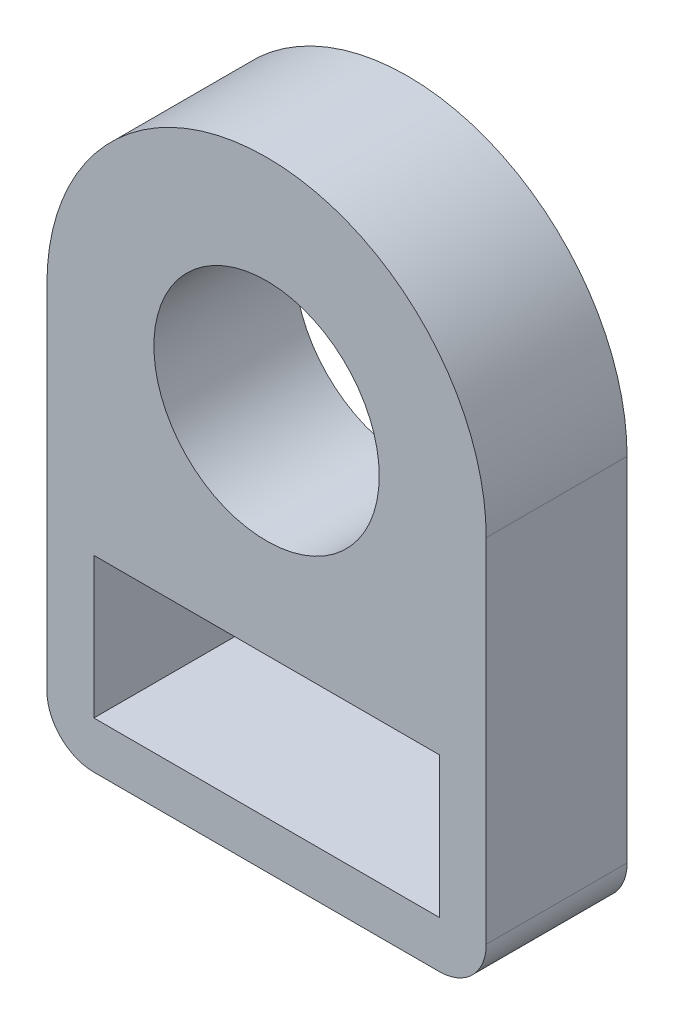
ISO-10303-21;
HEADER;
FILE_DESCRIPTION(('STEP AP214'),'2;1');
FILE_NAME('part.step','',(''),(''),'','','');
FILE_SCHEMA(('AUTOMOTIVE_DESIGN { 1 0 10303 214 1 1 1 1 }'));
ENDSEC;
DATA;
#1=APPLICATION_CONTEXT('core data for automotive mechanical design processes');
#2=APPLICATION_PROTOCOL_DEFINITION('international standard','automotive_design',2000,#1);
#3=PRODUCT_CONTEXT('',#1,'mechanical');
#4=PRODUCT('Part','Part','',(#3));
#5=PRODUCT_RELATED_PRODUCT_CATEGORY('part','',(#4));
#6=PRODUCT_DEFINITION_FORMATION('','',#4);
#7=PRODUCT_DEFINITION_CONTEXT('part definition',#1,'design');
#8=PRODUCT_DEFINITION('design','',#6,#7);
#9=PRODUCT_DEFINITION_SHAPE('','',#8);
#10=(LENGTH_UNIT() NAMED_UNIT(*) SI_UNIT(.MILLI.,.METRE.));
#11=(NAMED_UNIT(*) PLANE_ANGLE_UNIT() SI_UNIT($,.RADIAN.));
#12=(NAMED_UNIT(*) SI_UNIT($,.STERADIAN.) SOLID_ANGLE_UNIT());
#13=UNCERTAINTY_MEASURE_WITH_UNIT(LENGTH_MEASURE(1.E-05),#10,'distance_accuracy_value','');
#14=(GEOMETRIC_REPRESENTATION_CONTEXT(3) GLOBAL_UNCERTAINTY_ASSIGNED_CONTEXT((#13)) GLOBAL_UNIT_ASSIGNED_CONTEXT((#10,
#11,#12)) REPRESENTATION_CONTEXT('',''));
#15=CARTESIAN_POINT('',(0.,0.,0.));
#16=DIRECTION('',(0.,0.,1.));
#17=DIRECTION('',(1.,0.,0.));
#18=AXIS2_PLACEMENT_3D('',#15,#16,#17);
#19=CARTESIAN_POINT('',(-18.39,-7.5,15.));
#20=DIRECTION('',(0.,0.,-1.));
#21=DIRECTION('',(-1.,0.,0.));
#22=AXIS2_PLACEMENT_3D('',#19,#20,#21);
#23=PLANE('',#22);
#24=CARTESIAN_POINT('',(-18.39,-7.5,15.));
#25=DIRECTION('',(0.,0.,1.));
#26=DIRECTION('',(-1.,0.,0.));
#27=AXIS2_PLACEMENT_3D('',#24,#25,#26);
#28=CIRCLE('',#27,5.);
#29=CARTESIAN_POINT('',(-23.39,-7.5,15.));
#30=VERTEX_POINT('',#29);
#31=CARTESIAN_POINT('',(-18.39,-12.5,15.));
#32=VERTEX_POINT('',#31);
#33=EDGE_CURVE('E150',#30,#32,#28,.T.);
#34=ORIENTED_EDGE('',*,*,#33,.T.);
#35=DIRECTION('',(1.,0.,0.));
#36=VECTOR('',#35,1.);
#37=CARTESIAN_POINT('',(-18.39,-12.5,15.));
#38=LINE('',#37,#36);
#39=CARTESIAN_POINT('',(18.3903669358991,-12.5,15.));
#40=VERTEX_POINT('',#39);
#41=EDGE_CURVE('E153',#32,#40,#38,.T.);
#42=ORIENTED_EDGE('',*,*,#41,.T.);
#43=CARTESIAN_POINT('',(18.3903669358991,-7.49999999999999,15.));
#44=DIRECTION('',(0.,0.,1.));
#45=DIRECTION('',(1.,0.,0.));
#46=AXIS2_PLACEMENT_3D('',#43,#44,#45);
#47=CIRCLE('',#46,5.);
#48=CARTESIAN_POINT('',(23.3903269571223,-7.48000534647723,15.));
#49=VERTEX_POINT('',#48);
#50=EDGE_CURVE('E156',#40,#49,#47,.T.);
#51=ORIENTED_EDGE('',*,*,#50,.T.);
#52=DIRECTION('',(0.,1.,0.));
#53=VECTOR('',#52,1.);
#54=CARTESIAN_POINT('',(23.3903269571223,-7.48000534647723,15.));
#55=LINE('',#54,#53);
#56=CARTESIAN_POINT('',(23.3903269571223,30.02,15.));
#57=VERTEX_POINT('',#56);
#58=EDGE_CURVE('E158',#49,#57,#55,.T.);
#59=ORIENTED_EDGE('',*,*,#58,.T.);
#60=CARTESIAN_POINT('',(0.000163478561169064,30.02,15.));
#61=DIRECTION('',(0.,0.,1.));
#62=DIRECTION('',(-1.,0.,0.));
#63=AXIS2_PLACEMENT_3D('',#60,#61,#62);
#64=CIRCLE('',#63,23.3901634785612);
#65=CARTESIAN_POINT('',(-23.39,30.02,15.));
#66=VERTEX_POINT('',#65);
#67=EDGE_CURVE('E160',#57,#66,#64,.T.);
#68=ORIENTED_EDGE('',*,*,#67,.T.);
#69=DIRECTION('',(0.,-1.,0.));
#70=VECTOR('',#69,1.);
#71=CARTESIAN_POINT('',(-23.39,-7.5,15.));
#72=LINE('',#71,#70);
#73=EDGE_CURVE('E162',#66,#30,#72,.T.);
#74=ORIENTED_EDGE('',*,*,#73,.T.);
#75=EDGE_LOOP('',(#34,#42,#51,#59,#68,#74));
#76=FACE_BOUND('',#75,.T.);
#77=DIRECTION('',(0.,1.,0.));
#78=VECTOR('',#77,1.);
#79=CARTESIAN_POINT('',(18.39,7.5,15.));
#80=LINE('',#79,#78);
#81=CARTESIAN_POINT('',(18.39,-7.5,15.));
#82=VERTEX_POINT('',#81);
#83=CARTESIAN_POINT('',(18.39,7.5,15.));
#84=VERTEX_POINT('',#83);
#85=EDGE_CURVE('E111',#82,#84,#80,.T.);
#86=ORIENTED_EDGE('',*,*,#85,.F.);
#87=DIRECTION('',(1.,0.,0.));
#88=VECTOR('',#87,1.);
#89=CARTESIAN_POINT('',(-18.39,-7.5,15.));
#90=LINE('',#89,#88);
#91=CARTESIAN_POINT('',(-18.39,-7.5,15.));
#92=VERTEX_POINT('',#91);
#93=EDGE_CURVE('E134',#92,#82,#90,.T.);
#94=ORIENTED_EDGE('',*,*,#93,.F.);
#95=DIRECTION('',(0.,-1.,0.));
#96=VECTOR('',#95,1.);
#97=CARTESIAN_POINT('',(-18.39,7.5,15.));
#98=LINE('',#97,#96);
#99=CARTESIAN_POINT('',(-18.39,7.5,15.));
#100=VERTEX_POINT('',#99);
#101=EDGE_CURVE('E132',#100,#92,#98,.T.);
#102=ORIENTED_EDGE('',*,*,#101,.F.);
#103=DIRECTION('',(-1.,0.,0.));
#104=VECTOR('',#103,1.);
#105=CARTESIAN_POINT('',(-18.39,7.5,15.));
#106=LINE('',#105,#104);
#107=EDGE_CURVE('E119',#84,#100,#106,.T.);
#108=ORIENTED_EDGE('',*,*,#107,.F.);
#109=EDGE_LOOP('',(#86,#94,#102,#108));
#110=FACE_BOUND('',#109,.T.);
#111=CARTESIAN_POINT('',(0.,30.02,15.));
#112=DIRECTION('',(0.,0.,1.));
#113=DIRECTION('',(1.,0.,0.));
#114=AXIS2_PLACEMENT_3D('',#111,#112,#113);
#115=CIRCLE('',#114,12.);
#116=CARTESIAN_POINT('',(12.,30.02,15.));
#117=VERTEX_POINT('',#116);
#118=EDGE_CURVE('E140',#117,#117,#115,.T.);
#119=ORIENTED_EDGE('',*,*,#118,.F.);
#120=EDGE_LOOP('',(#119));
#121=FACE_BOUND('',#120,.T.);
#122=ADVANCED_FACE('F34',(#76,#110,#121),#23,.F.);
#123=CARTESIAN_POINT('',(-18.39,-7.5,0.));
#124=DIRECTION('',(0.,0.,-1.));
#125=DIRECTION('',(-1.,0.,0.));
#126=AXIS2_PLACEMENT_3D('',#123,#124,#125);
#127=PLANE('',#126);
#128=DIRECTION('',(1.,0.,0.));
#129=VECTOR('',#128,1.);
#130=CARTESIAN_POINT('',(-18.39,-7.5,0.));
#131=LINE('',#130,#129);
#132=CARTESIAN_POINT('',(-18.39,-7.5,0.));
#133=VERTEX_POINT('',#132);
#134=CARTESIAN_POINT('',(18.39,-7.5,0.));
#135=VERTEX_POINT('',#134);
#136=EDGE_CURVE('E120',#133,#135,#131,.T.);
#137=ORIENTED_EDGE('',*,*,#136,.T.);
#138=DIRECTION('',(0.,1.,0.));
#139=VECTOR('',#138,1.);
#140=CARTESIAN_POINT('',(18.39,7.5,0.));
#141=LINE('',#140,#139);
#142=CARTESIAN_POINT('',(18.39,7.5,0.));
#143=VERTEX_POINT('',#142);
#144=EDGE_CURVE('E57',#135,#143,#141,.T.);
#145=ORIENTED_EDGE('',*,*,#144,.T.);
#146=DIRECTION('',(-1.,0.,0.));
#147=VECTOR('',#146,1.);
#148=CARTESIAN_POINT('',(-18.39,7.5,0.));
#149=LINE('',#148,#147);
#150=CARTESIAN_POINT('',(-18.39,7.5,0.));
#151=VERTEX_POINT('',#150);
#152=EDGE_CURVE('E126',#143,#151,#149,.T.);
#153=ORIENTED_EDGE('',*,*,#152,.T.);
#154=DIRECTION('',(0.,-1.,0.));
#155=VECTOR('',#154,1.);
#156=CARTESIAN_POINT('',(-18.39,7.5,0.));
#157=LINE('',#156,#155);
#158=EDGE_CURVE('E142',#151,#133,#157,.T.);
#159=ORIENTED_EDGE('',*,*,#158,.T.);
#160=EDGE_LOOP('',(#137,#145,#153,#159));
#161=FACE_BOUND('',#160,.T.);
#162=CARTESIAN_POINT('',(-18.39,-7.5,0.));
#163=DIRECTION('',(0.,0.,1.));
#164=DIRECTION('',(-1.,0.,0.));
#165=AXIS2_PLACEMENT_3D('',#162,#163,#164);
#166=CIRCLE('',#165,5.);
#167=CARTESIAN_POINT('',(-23.39,-7.5,0.));
#168=VERTEX_POINT('',#167);
#169=CARTESIAN_POINT('',(-18.39,-12.5,0.));
#170=VERTEX_POINT('',#169);
#171=EDGE_CURVE('E127',#168,#170,#166,.T.);
#172=ORIENTED_EDGE('',*,*,#171,.F.);
#173=DIRECTION('',(0.,-1.,0.));
#174=VECTOR('',#173,1.);
#175=CARTESIAN_POINT('',(-23.39,-7.5,0.));
#176=LINE('',#175,#174);
#177=CARTESIAN_POINT('',(-23.39,30.02,0.));
#178=VERTEX_POINT('',#177);
#179=EDGE_CURVE('E154',#178,#168,#176,.T.);
#180=ORIENTED_EDGE('',*,*,#179,.F.);
#181=CARTESIAN_POINT('',(0.000163478561169064,30.02,0.));
#182=DIRECTION('',(0.,0.,1.));
#183=DIRECTION('',(-1.,0.,0.));
#184=AXIS2_PLACEMENT_3D('',#181,#182,#183);
#185=CIRCLE('',#184,23.3901634785612);
#186=CARTESIAN_POINT('',(23.3903269571223,30.02,0.));
#187=VERTEX_POINT('',#186);
#188=EDGE_CURVE('E173',#187,#178,#185,.T.);
#189=ORIENTED_EDGE('',*,*,#188,.F.);
#190=DIRECTION('',(0.,1.,0.));
#191=VECTOR('',#190,1.);
#192=CARTESIAN_POINT('',(23.3903269571223,-7.48000534647723,0.));
#193=LINE('',#192,#191);
#194=CARTESIAN_POINT('',(23.3903269571223,-7.48000534647723,0.));
#195=VERTEX_POINT('',#194);
#196=EDGE_CURVE('E171',#195,#187,#193,.T.);
#197=ORIENTED_EDGE('',*,*,#196,.F.);
#198=CARTESIAN_POINT('',(18.3903669358991,-7.49999999999999,0.));
#199=DIRECTION('',(0.,0.,1.));
#200=DIRECTION('',(1.,0.,0.));
#201=AXIS2_PLACEMENT_3D('',#198,#199,#200);
#202=CIRCLE('',#201,5.);
#203=CARTESIAN_POINT('',(18.3903669358991,-12.5,0.));
#204=VERTEX_POINT('',#203);
#205=EDGE_CURVE('E169',#204,#195,#202,.T.);
#206=ORIENTED_EDGE('',*,*,#205,.F.);
#207=DIRECTION('',(1.,0.,0.));
#208=VECTOR('',#207,1.);
#209=CARTESIAN_POINT('',(-18.39,-12.5,0.));
#210=LINE('',#209,#208);
#211=EDGE_CURVE('E167',#170,#204,#210,.T.);
#212=ORIENTED_EDGE('',*,*,#211,.F.);
#213=EDGE_LOOP('',(#172,#180,#189,#197,#206,#212));
#214=FACE_BOUND('',#213,.T.);
#215=CARTESIAN_POINT('',(0.,30.02,0.));
#216=DIRECTION('',(0.,0.,1.));
#217=DIRECTION('',(1.,0.,0.));
#218=AXIS2_PLACEMENT_3D('',#215,#216,#217);
#219=CIRCLE('',#218,12.);
#220=CARTESIAN_POINT('',(12.,30.02,0.));
#221=VERTEX_POINT('',#220);
#222=EDGE_CURVE('E253',#221,#221,#219,.T.);
#223=ORIENTED_EDGE('',*,*,#222,.T.);
#224=EDGE_LOOP('',(#223));
#225=FACE_BOUND('',#224,.T.);
#226=ADVANCED_FACE('F197',(#161,#214,#225),#127,.T.);
#227=CARTESIAN_POINT('',(-18.39,-7.5,15.));
#228=DIRECTION('',(0.,0.,-1.));
#229=DIRECTION('',(-1.,0.,0.));
#230=AXIS2_PLACEMENT_3D('',#227,#228,#229);
#231=CYLINDRICAL_SURFACE('',#230,5.);
#232=ORIENTED_EDGE('',*,*,#171,.T.);
#233=DIRECTION('',(0.,0.,-1.));
#234=VECTOR('',#233,1.);
#235=CARTESIAN_POINT('',(-18.39,-12.5,15.));
#236=LINE('',#235,#234);
#237=EDGE_CURVE('E11',#32,#170,#236,.T.);
#238=ORIENTED_EDGE('',*,*,#237,.F.);
#239=ORIENTED_EDGE('',*,*,#33,.F.);
#240=DIRECTION('',(0.,0.,-1.));
#241=VECTOR('',#240,1.);
#242=CARTESIAN_POINT('',(-23.39,-7.5,15.));
#243=LINE('',#242,#241);
#244=EDGE_CURVE('E164',#30,#168,#243,.T.);
#245=ORIENTED_EDGE('',*,*,#244,.T.);
#246=EDGE_LOOP('',(#232,#238,#239,#245));
#247=FACE_BOUND('',#246,.T.);
#248=ADVANCED_FACE('F36',(#247),#231,.T.);
#249=CARTESIAN_POINT('',(-18.39,-12.5,15.));
#250=DIRECTION('',(0.,1.,0.));
#251=DIRECTION('',(0.,0.,1.));
#252=AXIS2_PLACEMENT_3D('',#249,#250,#251);
#253=PLANE('',#252);
#254=ORIENTED_EDGE('',*,*,#211,.T.);
#255=DIRECTION('',(0.,0.,-1.));
#256=VECTOR('',#255,1.);
#257=CARTESIAN_POINT('',(18.3903669358991,-12.5,15.));
#258=LINE('',#257,#256);
#259=EDGE_CURVE('E42',#40,#204,#258,.T.);
#260=ORIENTED_EDGE('',*,*,#259,.F.);
#261=ORIENTED_EDGE('',*,*,#41,.F.);
#262=ORIENTED_EDGE('',*,*,#237,.T.);
#263=EDGE_LOOP('',(#254,#260,#261,#262));
#264=FACE_BOUND('',#263,.T.);
#265=ADVANCED_FACE('F214',(#264),#253,.F.);
#266=CARTESIAN_POINT('',(18.3903669358991,-7.49999999999999,15.));
#267=DIRECTION('',(0.,0.,-1.));
#268=DIRECTION('',(-1.,0.,0.));
#269=AXIS2_PLACEMENT_3D('',#266,#267,#268);
#270=CYLINDRICAL_SURFACE('',#269,5.);
#271=ORIENTED_EDGE('',*,*,#205,.T.);
#272=DIRECTION('',(0.,0.,-1.));
#273=VECTOR('',#272,1.);
#274=CARTESIAN_POINT('',(23.3903269571223,-7.48000534647723,15.));
#275=LINE('',#274,#273);
#276=EDGE_CURVE('E184',#49,#195,#275,.T.);
#277=ORIENTED_EDGE('',*,*,#276,.F.);
#278=ORIENTED_EDGE('',*,*,#50,.F.);
#279=ORIENTED_EDGE('',*,*,#259,.T.);
#280=EDGE_LOOP('',(#271,#277,#278,#279));
#281=FACE_BOUND('',#280,.T.);
#282=ADVANCED_FACE('F191',(#281),#270,.T.);
#283=CARTESIAN_POINT('',(23.3903269571223,-7.48000534647723,15.));
#284=DIRECTION('',(-1.,0.,0.));
#285=DIRECTION('',(0.,0.,1.));
#286=AXIS2_PLACEMENT_3D('',#283,#284,#285);
#287=PLANE('',#286);
#288=ORIENTED_EDGE('',*,*,#196,.T.);
#289=DIRECTION('',(0.,0.,-1.));
#290=VECTOR('',#289,1.);
#291=CARTESIAN_POINT('',(23.3903269571223,30.02,15.));
#292=LINE('',#291,#290);
#293=EDGE_CURVE('E181',#57,#187,#292,.T.);
#294=ORIENTED_EDGE('',*,*,#293,.F.);
#295=ORIENTED_EDGE('',*,*,#58,.F.);
#296=ORIENTED_EDGE('',*,*,#276,.T.);
#297=EDGE_LOOP('',(#288,#294,#295,#296));
#298=FACE_BOUND('',#297,.T.);
#299=ADVANCED_FACE('F203',(#298),#287,.F.);
#300=CARTESIAN_POINT('',(0.000163478561169064,30.02,15.));
#301=DIRECTION('',(0.,0.,-1.));
#302=DIRECTION('',(-1.,0.,0.));
#303=AXIS2_PLACEMENT_3D('',#300,#301,#302);
#304=CYLINDRICAL_SURFACE('',#303,23.3901634785612);
#305=ORIENTED_EDGE('',*,*,#188,.T.);
#306=DIRECTION('',(0.,0.,-1.));
#307=VECTOR('',#306,1.);
#308=CARTESIAN_POINT('',(-23.39,30.02,15.));
#309=LINE('',#308,#307);
#310=EDGE_CURVE('E178',#66,#178,#309,.T.);
#311=ORIENTED_EDGE('',*,*,#310,.F.);
#312=ORIENTED_EDGE('',*,*,#67,.F.);
#313=ORIENTED_EDGE('',*,*,#293,.T.);
#314=EDGE_LOOP('',(#305,#311,#312,#313));
#315=FACE_BOUND('',#314,.T.);
#316=ADVANCED_FACE('F207',(#315),#304,.T.);
#317=CARTESIAN_POINT('',(-23.39,-7.5,15.));
#318=DIRECTION('',(1.,0.,0.));
#319=DIRECTION('',(0.,0.,-1.));
#320=AXIS2_PLACEMENT_3D('',#317,#318,#319);
#321=PLANE('',#320);
#322=ORIENTED_EDGE('',*,*,#179,.T.);
#323=ORIENTED_EDGE('',*,*,#244,.F.);
#324=ORIENTED_EDGE('',*,*,#73,.F.);
#325=ORIENTED_EDGE('',*,*,#310,.T.);
#326=EDGE_LOOP('',(#322,#323,#324,#325));
#327=FACE_BOUND('',#326,.T.);
#328=ADVANCED_FACE('F217',(#327),#321,.F.);
#329=CARTESIAN_POINT('',(18.39,7.5,15.));
#330=DIRECTION('',(-1.,0.,0.));
#331=DIRECTION('',(0.,0.,1.));
#332=AXIS2_PLACEMENT_3D('',#329,#330,#331);
#333=PLANE('',#332);
#334=ORIENTED_EDGE('',*,*,#144,.F.);
#335=DIRECTION('',(0.,0.,-1.));
#336=VECTOR('',#335,1.);
#337=CARTESIAN_POINT('',(18.39,-7.5,15.));
#338=LINE('',#337,#336);
#339=EDGE_CURVE('E115',#82,#135,#338,.T.);
#340=ORIENTED_EDGE('',*,*,#339,.F.);
#341=ORIENTED_EDGE('',*,*,#85,.T.);
#342=DIRECTION('',(0.,0.,-1.));
#343=VECTOR('',#342,1.);
#344=CARTESIAN_POINT('',(18.39,7.5,15.));
#345=LINE('',#344,#343);
#346=EDGE_CURVE('E114',#84,#143,#345,.T.);
#347=ORIENTED_EDGE('',*,*,#346,.T.);
#348=EDGE_LOOP('',(#334,#340,#341,#347));
#349=FACE_BOUND('',#348,.T.);
#350=ADVANCED_FACE('F113',(#349),#333,.T.);
#351=CARTESIAN_POINT('',(-18.39,7.5,15.));
#352=DIRECTION('',(0.,-1.,0.));
#353=DIRECTION('',(0.,0.,-1.));
#354=AXIS2_PLACEMENT_3D('',#351,#352,#353);
#355=PLANE('',#354);
#356=ORIENTED_EDGE('',*,*,#152,.F.);
#357=ORIENTED_EDGE('',*,*,#346,.F.);
#358=ORIENTED_EDGE('',*,*,#107,.T.);
#359=DIRECTION('',(0.,0.,-1.));
#360=VECTOR('',#359,1.);
#361=CARTESIAN_POINT('',(-18.39,7.5,15.));
#362=LINE('',#361,#360);
#363=EDGE_CURVE('E128',#100,#151,#362,.T.);
#364=ORIENTED_EDGE('',*,*,#363,.T.);
#365=EDGE_LOOP('',(#356,#357,#358,#364));
#366=FACE_BOUND('',#365,.T.);
#367=ADVANCED_FACE('F123',(#366),#355,.T.);
#368=CARTESIAN_POINT('',(-18.39,7.5,15.));
#369=DIRECTION('',(1.,0.,0.));
#370=DIRECTION('',(0.,0.,-1.));
#371=AXIS2_PLACEMENT_3D('',#368,#369,#370);
#372=PLANE('',#371);
#373=ORIENTED_EDGE('',*,*,#158,.F.);
#374=ORIENTED_EDGE('',*,*,#363,.F.);
#375=ORIENTED_EDGE('',*,*,#101,.T.);
#376=DIRECTION('',(0.,0.,-1.));
#377=VECTOR('',#376,1.);
#378=CARTESIAN_POINT('',(-18.39,-7.5,15.));
#379=LINE('',#378,#377);
#380=EDGE_CURVE('E49',#92,#133,#379,.T.);
#381=ORIENTED_EDGE('',*,*,#380,.T.);
#382=EDGE_LOOP('',(#373,#374,#375,#381));
#383=FACE_BOUND('',#382,.T.);
#384=ADVANCED_FACE('F236',(#383),#372,.T.);
#385=CARTESIAN_POINT('',(-18.39,-7.5,15.));
#386=DIRECTION('',(0.,1.,0.));
#387=DIRECTION('',(0.,0.,1.));
#388=AXIS2_PLACEMENT_3D('',#385,#386,#387);
#389=PLANE('',#388);
#390=ORIENTED_EDGE('',*,*,#136,.F.);
#391=ORIENTED_EDGE('',*,*,#380,.F.);
#392=ORIENTED_EDGE('',*,*,#93,.T.);
#393=ORIENTED_EDGE('',*,*,#339,.T.);
#394=EDGE_LOOP('',(#390,#391,#392,#393));
#395=FACE_BOUND('',#394,.T.);
#396=ADVANCED_FACE('F239',(#395),#389,.T.);
#397=CARTESIAN_POINT('',(0.,30.02,15.));
#398=DIRECTION('',(0.,0.,-1.));
#399=DIRECTION('',(-1.,0.,0.));
#400=AXIS2_PLACEMENT_3D('',#397,#398,#399);
#401=CYLINDRICAL_SURFACE('',#400,12.);
#402=ORIENTED_EDGE('',*,*,#118,.T.);
#403=EDGE_LOOP('',(#402));
#404=FACE_BOUND('',#403,.T.);
#405=ORIENTED_EDGE('',*,*,#222,.F.);
#406=EDGE_LOOP('',(#405));
#407=FACE_BOUND('',#406,.T.);
#408=ADVANCED_FACE('F243',(#404,#407),#401,.F.);
#409=CLOSED_SHELL('',(#122,#226,#248,#265,#282,#299,#316,#328,#350,#367,#384,#396,#408));
#410=MANIFOLD_SOLID_BREP('B2',#409);
#411=ADVANCED_BREP_SHAPE_REPRESENTATION('',(#18,#410),#14);
#412=SHAPE_DEFINITION_REPRESENTATION(#9,#411);
ENDSEC;
END-ISO-10303-21;
